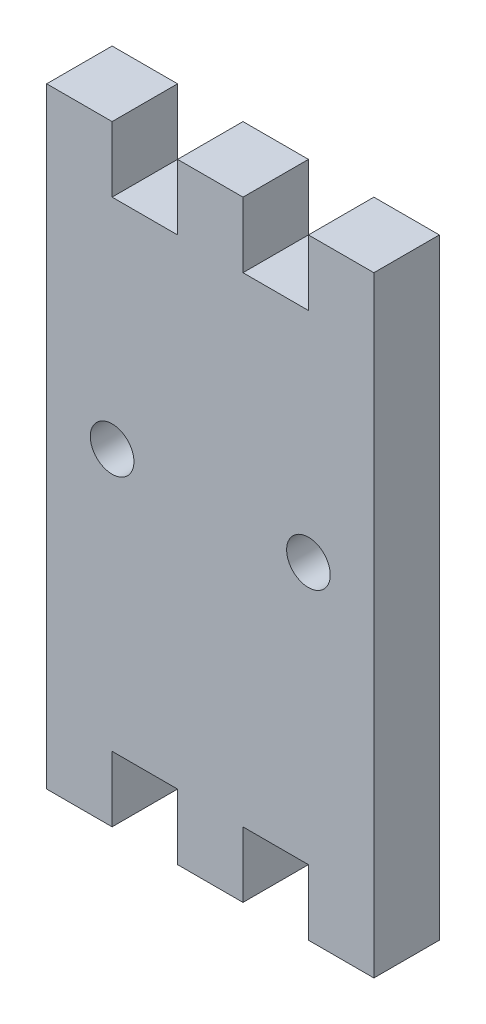
ISO-10303-21;
HEADER;
FILE_DESCRIPTION(('STEP AP214'),'2;1');
FILE_NAME('part.step','',(''),(''),'','','');
FILE_SCHEMA(('AUTOMOTIVE_DESIGN { 1 0 10303 214 1 1 1 1 }'));
ENDSEC;
DATA;
#1=APPLICATION_CONTEXT('core data for automotive mechanical design processes');
#2=APPLICATION_PROTOCOL_DEFINITION('international standard','automotive_design',2000,#1);
#3=PRODUCT_CONTEXT('',#1,'mechanical');
#4=PRODUCT('Part','Part','',(#3));
#5=PRODUCT_RELATED_PRODUCT_CATEGORY('part','',(#4));
#6=PRODUCT_DEFINITION_FORMATION('','',#4);
#7=PRODUCT_DEFINITION_CONTEXT('part definition',#1,'design');
#8=PRODUCT_DEFINITION('design','',#6,#7);
#9=PRODUCT_DEFINITION_SHAPE('','',#8);
#10=(LENGTH_UNIT() NAMED_UNIT(*) SI_UNIT(.MILLI.,.METRE.));
#11=(NAMED_UNIT(*) PLANE_ANGLE_UNIT() SI_UNIT($,.RADIAN.));
#12=(NAMED_UNIT(*) SI_UNIT($,.STERADIAN.) SOLID_ANGLE_UNIT());
#13=UNCERTAINTY_MEASURE_WITH_UNIT(LENGTH_MEASURE(1.E-05),#10,'distance_accuracy_value','');
#14=(GEOMETRIC_REPRESENTATION_CONTEXT(3) GLOBAL_UNCERTAINTY_ASSIGNED_CONTEXT((#13)) GLOBAL_UNIT_ASSIGNED_CONTEXT((#10,
#11,#12)) REPRESENTATION_CONTEXT('',''));
#15=CARTESIAN_POINT('',(0.,0.,0.));
#16=DIRECTION('',(0.,0.,1.));
#17=DIRECTION('',(1.,0.,0.));
#18=AXIS2_PLACEMENT_3D('',#15,#16,#17);
#19=CARTESIAN_POINT('',(0.,0.,3.));
#20=DIRECTION('',(0.,0.,1.));
#21=DIRECTION('',(1.,0.,0.));
#22=AXIS2_PLACEMENT_3D('',#19,#20,#21);
#23=PLANE('',#22);
#24=CARTESIAN_POINT('',(-4.5,0.999999999999999,3.));
#25=DIRECTION('',(0.,0.,1.));
#26=DIRECTION('',(1.,0.,0.));
#27=AXIS2_PLACEMENT_3D('',#24,#25,#26);
#28=CIRCLE('',#27,1.);
#29=CARTESIAN_POINT('',(-3.5,0.999999999999999,3.));
#30=VERTEX_POINT('',#29);
#31=EDGE_CURVE('E209',#30,#30,#28,.T.);
#32=ORIENTED_EDGE('',*,*,#31,.F.);
#33=EDGE_LOOP('',(#32));
#34=FACE_BOUND('',#33,.T.);
#35=DIRECTION('',(-1.,0.,0.));
#36=VECTOR('',#35,1.);
#37=CARTESIAN_POINT('',(4.5,14.,3.));
#38=LINE('',#37,#36);
#39=CARTESIAN_POINT('',(7.5,14.,3.));
#40=VERTEX_POINT('',#39);
#41=CARTESIAN_POINT('',(4.5,14.,3.));
#42=VERTEX_POINT('',#41);
#43=EDGE_CURVE('E244',#40,#42,#38,.T.);
#44=ORIENTED_EDGE('',*,*,#43,.T.);
#45=DIRECTION('',(0.,-1.,0.));
#46=VECTOR('',#45,1.);
#47=CARTESIAN_POINT('',(4.5,14.,3.));
#48=LINE('',#47,#46);
#49=CARTESIAN_POINT('',(4.5,11.,3.));
#50=VERTEX_POINT('',#49);
#51=EDGE_CURVE('E132',#42,#50,#48,.T.);
#52=ORIENTED_EDGE('',*,*,#51,.T.);
#53=DIRECTION('',(-1.,0.,0.));
#54=VECTOR('',#53,1.);
#55=CARTESIAN_POINT('',(4.5,11.,3.));
#56=LINE('',#55,#54);
#57=CARTESIAN_POINT('',(1.5,11.,3.));
#58=VERTEX_POINT('',#57);
#59=EDGE_CURVE('E295',#50,#58,#56,.T.);
#60=ORIENTED_EDGE('',*,*,#59,.T.);
#61=DIRECTION('',(0.,1.,0.));
#62=VECTOR('',#61,1.);
#63=CARTESIAN_POINT('',(1.5,14.,3.));
#64=LINE('',#63,#62);
#65=CARTESIAN_POINT('',(1.5,14.,3.));
#66=VERTEX_POINT('',#65);
#67=EDGE_CURVE('E314',#58,#66,#64,.T.);
#68=ORIENTED_EDGE('',*,*,#67,.T.);
#69=DIRECTION('',(-1.,0.,0.));
#70=VECTOR('',#69,1.);
#71=CARTESIAN_POINT('',(-1.5,14.,3.));
#72=LINE('',#71,#70);
#73=CARTESIAN_POINT('',(-1.5,14.,3.));
#74=VERTEX_POINT('',#73);
#75=EDGE_CURVE('E311',#66,#74,#72,.T.);
#76=ORIENTED_EDGE('',*,*,#75,.T.);
#77=DIRECTION('',(0.,-1.,0.));
#78=VECTOR('',#77,1.);
#79=CARTESIAN_POINT('',(-1.5,14.,3.));
#80=LINE('',#79,#78);
#81=CARTESIAN_POINT('',(-1.5,11.,3.));
#82=VERTEX_POINT('',#81);
#83=EDGE_CURVE('E313',#74,#82,#80,.T.);
#84=ORIENTED_EDGE('',*,*,#83,.T.);
#85=DIRECTION('',(-1.,0.,0.));
#86=VECTOR('',#85,1.);
#87=CARTESIAN_POINT('',(-4.5,11.,3.));
#88=LINE('',#87,#86);
#89=CARTESIAN_POINT('',(-4.5,11.,3.));
#90=VERTEX_POINT('',#89);
#91=EDGE_CURVE('E316',#82,#90,#88,.T.);
#92=ORIENTED_EDGE('',*,*,#91,.T.);
#93=DIRECTION('',(0.,1.,0.));
#94=VECTOR('',#93,1.);
#95=CARTESIAN_POINT('',(-4.5,14.,3.));
#96=LINE('',#95,#94);
#97=CARTESIAN_POINT('',(-4.5,14.,3.));
#98=VERTEX_POINT('',#97);
#99=EDGE_CURVE('E322',#90,#98,#96,.T.);
#100=ORIENTED_EDGE('',*,*,#99,.T.);
#101=DIRECTION('',(-1.,0.,0.));
#102=VECTOR('',#101,1.);
#103=CARTESIAN_POINT('',(-7.5,14.,3.));
#104=LINE('',#103,#102);
#105=CARTESIAN_POINT('',(-7.5,14.,3.));
#106=VERTEX_POINT('',#105);
#107=EDGE_CURVE('E324',#98,#106,#104,.T.);
#108=ORIENTED_EDGE('',*,*,#107,.T.);
#109=DIRECTION('',(0.,-1.,0.));
#110=VECTOR('',#109,1.);
#111=CARTESIAN_POINT('',(-7.5,-14.,3.));
#112=LINE('',#111,#110);
#113=CARTESIAN_POINT('',(-7.5,-14.,3.));
#114=VERTEX_POINT('',#113);
#115=EDGE_CURVE('E326',#106,#114,#112,.T.);
#116=ORIENTED_EDGE('',*,*,#115,.T.);
#117=DIRECTION('',(1.,0.,0.));
#118=VECTOR('',#117,1.);
#119=CARTESIAN_POINT('',(-7.5,-14.,3.));
#120=LINE('',#119,#118);
#121=CARTESIAN_POINT('',(-4.5,-14.,3.));
#122=VERTEX_POINT('',#121);
#123=EDGE_CURVE('E328',#114,#122,#120,.T.);
#124=ORIENTED_EDGE('',*,*,#123,.T.);
#125=DIRECTION('',(0.,1.,0.));
#126=VECTOR('',#125,1.);
#127=CARTESIAN_POINT('',(-4.5,-11.,3.));
#128=LINE('',#127,#126);
#129=CARTESIAN_POINT('',(-4.5,-11.,3.));
#130=VERTEX_POINT('',#129);
#131=EDGE_CURVE('E330',#122,#130,#128,.T.);
#132=ORIENTED_EDGE('',*,*,#131,.T.);
#133=DIRECTION('',(1.,0.,0.));
#134=VECTOR('',#133,1.);
#135=CARTESIAN_POINT('',(-4.5,-11.,3.));
#136=LINE('',#135,#134);
#137=CARTESIAN_POINT('',(-1.5,-11.,3.));
#138=VERTEX_POINT('',#137);
#139=EDGE_CURVE('E332',#130,#138,#136,.T.);
#140=ORIENTED_EDGE('',*,*,#139,.T.);
#141=DIRECTION('',(0.,-1.,0.));
#142=VECTOR('',#141,1.);
#143=CARTESIAN_POINT('',(-1.5,-11.,3.));
#144=LINE('',#143,#142);
#145=CARTESIAN_POINT('',(-1.5,-14.,3.));
#146=VERTEX_POINT('',#145);
#147=EDGE_CURVE('E334',#138,#146,#144,.T.);
#148=ORIENTED_EDGE('',*,*,#147,.T.);
#149=DIRECTION('',(1.,0.,0.));
#150=VECTOR('',#149,1.);
#151=CARTESIAN_POINT('',(-1.5,-14.,3.));
#152=LINE('',#151,#150);
#153=CARTESIAN_POINT('',(1.5,-14.,3.));
#154=VERTEX_POINT('',#153);
#155=EDGE_CURVE('E336',#146,#154,#152,.T.);
#156=ORIENTED_EDGE('',*,*,#155,.T.);
#157=DIRECTION('',(0.,1.,0.));
#158=VECTOR('',#157,1.);
#159=CARTESIAN_POINT('',(1.5,-11.,3.));
#160=LINE('',#159,#158);
#161=CARTESIAN_POINT('',(1.5,-11.,3.));
#162=VERTEX_POINT('',#161);
#163=EDGE_CURVE('E338',#154,#162,#160,.T.);
#164=ORIENTED_EDGE('',*,*,#163,.T.);
#165=DIRECTION('',(1.,0.,0.));
#166=VECTOR('',#165,1.);
#167=CARTESIAN_POINT('',(1.5,-11.,3.));
#168=LINE('',#167,#166);
#169=CARTESIAN_POINT('',(4.5,-11.,3.));
#170=VERTEX_POINT('',#169);
#171=EDGE_CURVE('E187',#162,#170,#168,.T.);
#172=ORIENTED_EDGE('',*,*,#171,.T.);
#173=DIRECTION('',(0.,-1.,0.));
#174=VECTOR('',#173,1.);
#175=CARTESIAN_POINT('',(4.5,-11.,3.));
#176=LINE('',#175,#174);
#177=CARTESIAN_POINT('',(4.5,-14.,3.));
#178=VERTEX_POINT('',#177);
#179=EDGE_CURVE('E181',#170,#178,#176,.T.);
#180=ORIENTED_EDGE('',*,*,#179,.T.);
#181=DIRECTION('',(1.,0.,0.));
#182=VECTOR('',#181,1.);
#183=CARTESIAN_POINT('',(4.5,-14.,3.));
#184=LINE('',#183,#182);
#185=CARTESIAN_POINT('',(7.5,-14.,3.));
#186=VERTEX_POINT('',#185);
#187=EDGE_CURVE('E185',#178,#186,#184,.T.);
#188=ORIENTED_EDGE('',*,*,#187,.T.);
#189=DIRECTION('',(0.,1.,0.));
#190=VECTOR('',#189,1.);
#191=CARTESIAN_POINT('',(7.5,-14.,3.));
#192=LINE('',#191,#190);
#193=EDGE_CURVE('E53',#186,#40,#192,.T.);
#194=ORIENTED_EDGE('',*,*,#193,.T.);
#195=EDGE_LOOP('',(#44,#52,#60,#68,#76,#84,#92,#100,#108,#116,#124,#132,#140,#148,#156,#164,
#172,#180,#188,#194));
#196=FACE_BOUND('',#195,.T.);
#197=CARTESIAN_POINT('',(4.5,1.,3.));
#198=DIRECTION('',(0.,0.,1.));
#199=DIRECTION('',(-1.,0.,0.));
#200=AXIS2_PLACEMENT_3D('',#197,#198,#199);
#201=CIRCLE('',#200,1.);
#202=CARTESIAN_POINT('',(3.5,1.,3.));
#203=VERTEX_POINT('',#202);
#204=EDGE_CURVE('E380',#203,#203,#201,.T.);
#205=ORIENTED_EDGE('',*,*,#204,.F.);
#206=EDGE_LOOP('',(#205));
#207=FACE_BOUND('',#206,.T.);
#208=ADVANCED_FACE('F36',(#34,#196,#207),#23,.T.);
#209=CARTESIAN_POINT('',(0.,0.,0.));
#210=DIRECTION('',(0.,0.,1.));
#211=DIRECTION('',(1.,0.,0.));
#212=AXIS2_PLACEMENT_3D('',#209,#210,#211);
#213=PLANE('',#212);
#214=DIRECTION('',(-1.,0.,0.));
#215=VECTOR('',#214,1.);
#216=CARTESIAN_POINT('',(4.5,14.,0.));
#217=LINE('',#216,#215);
#218=CARTESIAN_POINT('',(7.5,14.,0.));
#219=VERTEX_POINT('',#218);
#220=CARTESIAN_POINT('',(4.5,14.,0.));
#221=VERTEX_POINT('',#220);
#222=EDGE_CURVE('E205',#219,#221,#217,.T.);
#223=ORIENTED_EDGE('',*,*,#222,.F.);
#224=DIRECTION('',(0.,1.,0.));
#225=VECTOR('',#224,1.);
#226=CARTESIAN_POINT('',(7.5,-14.,0.));
#227=LINE('',#226,#225);
#228=CARTESIAN_POINT('',(7.5,-14.,0.));
#229=VERTEX_POINT('',#228);
#230=EDGE_CURVE('E124',#229,#219,#227,.T.);
#231=ORIENTED_EDGE('',*,*,#230,.F.);
#232=DIRECTION('',(1.,0.,0.));
#233=VECTOR('',#232,1.);
#234=CARTESIAN_POINT('',(4.5,-14.,0.));
#235=LINE('',#234,#233);
#236=CARTESIAN_POINT('',(4.5,-14.,0.));
#237=VERTEX_POINT('',#236);
#238=EDGE_CURVE('E118',#237,#229,#235,.T.);
#239=ORIENTED_EDGE('',*,*,#238,.F.);
#240=DIRECTION('',(0.,-1.,0.));
#241=VECTOR('',#240,1.);
#242=CARTESIAN_POINT('',(4.5,-11.,0.));
#243=LINE('',#242,#241);
#244=CARTESIAN_POINT('',(4.5,-11.,0.));
#245=VERTEX_POINT('',#244);
#246=EDGE_CURVE('E195',#245,#237,#243,.T.);
#247=ORIENTED_EDGE('',*,*,#246,.F.);
#248=DIRECTION('',(1.,0.,0.));
#249=VECTOR('',#248,1.);
#250=CARTESIAN_POINT('',(1.5,-11.,0.));
#251=LINE('',#250,#249);
#252=CARTESIAN_POINT('',(1.5,-11.,0.));
#253=VERTEX_POINT('',#252);
#254=EDGE_CURVE('E239',#253,#245,#251,.T.);
#255=ORIENTED_EDGE('',*,*,#254,.F.);
#256=DIRECTION('',(0.,1.,0.));
#257=VECTOR('',#256,1.);
#258=CARTESIAN_POINT('',(1.5,-11.,0.));
#259=LINE('',#258,#257);
#260=CARTESIAN_POINT('',(1.5,-14.,0.));
#261=VERTEX_POINT('',#260);
#262=EDGE_CURVE('E237',#261,#253,#259,.T.);
#263=ORIENTED_EDGE('',*,*,#262,.F.);
#264=DIRECTION('',(1.,0.,0.));
#265=VECTOR('',#264,1.);
#266=CARTESIAN_POINT('',(-1.5,-14.,0.));
#267=LINE('',#266,#265);
#268=CARTESIAN_POINT('',(-1.5,-14.,0.));
#269=VERTEX_POINT('',#268);
#270=EDGE_CURVE('E235',#269,#261,#267,.T.);
#271=ORIENTED_EDGE('',*,*,#270,.F.);
#272=DIRECTION('',(0.,-1.,0.));
#273=VECTOR('',#272,1.);
#274=CARTESIAN_POINT('',(-1.5,-11.,0.));
#275=LINE('',#274,#273);
#276=CARTESIAN_POINT('',(-1.5,-11.,0.));
#277=VERTEX_POINT('',#276);
#278=EDGE_CURVE('E233',#277,#269,#275,.T.);
#279=ORIENTED_EDGE('',*,*,#278,.F.);
#280=DIRECTION('',(1.,0.,0.));
#281=VECTOR('',#280,1.);
#282=CARTESIAN_POINT('',(-4.5,-11.,0.));
#283=LINE('',#282,#281);
#284=CARTESIAN_POINT('',(-4.5,-11.,0.));
#285=VERTEX_POINT('',#284);
#286=EDGE_CURVE('E231',#285,#277,#283,.T.);
#287=ORIENTED_EDGE('',*,*,#286,.F.);
#288=DIRECTION('',(0.,1.,0.));
#289=VECTOR('',#288,1.);
#290=CARTESIAN_POINT('',(-4.5,-11.,0.));
#291=LINE('',#290,#289);
#292=CARTESIAN_POINT('',(-4.5,-14.,0.));
#293=VERTEX_POINT('',#292);
#294=EDGE_CURVE('E229',#293,#285,#291,.T.);
#295=ORIENTED_EDGE('',*,*,#294,.F.);
#296=DIRECTION('',(1.,0.,0.));
#297=VECTOR('',#296,1.);
#298=CARTESIAN_POINT('',(-7.5,-14.,0.));
#299=LINE('',#298,#297);
#300=CARTESIAN_POINT('',(-7.5,-14.,0.));
#301=VERTEX_POINT('',#300);
#302=EDGE_CURVE('E227',#301,#293,#299,.T.);
#303=ORIENTED_EDGE('',*,*,#302,.F.);
#304=DIRECTION('',(0.,-1.,0.));
#305=VECTOR('',#304,1.);
#306=CARTESIAN_POINT('',(-7.5,-14.,0.));
#307=LINE('',#306,#305);
#308=CARTESIAN_POINT('',(-7.5,14.,0.));
#309=VERTEX_POINT('',#308);
#310=EDGE_CURVE('E225',#309,#301,#307,.T.);
#311=ORIENTED_EDGE('',*,*,#310,.F.);
#312=DIRECTION('',(-1.,0.,0.));
#313=VECTOR('',#312,1.);
#314=CARTESIAN_POINT('',(-7.5,14.,0.));
#315=LINE('',#314,#313);
#316=CARTESIAN_POINT('',(-4.5,14.,0.));
#317=VERTEX_POINT('',#316);
#318=EDGE_CURVE('E223',#317,#309,#315,.T.);
#319=ORIENTED_EDGE('',*,*,#318,.F.);
#320=DIRECTION('',(0.,1.,0.));
#321=VECTOR('',#320,1.);
#322=CARTESIAN_POINT('',(-4.5,14.,0.));
#323=LINE('',#322,#321);
#324=CARTESIAN_POINT('',(-4.5,11.,0.));
#325=VERTEX_POINT('',#324);
#326=EDGE_CURVE('E221',#325,#317,#323,.T.);
#327=ORIENTED_EDGE('',*,*,#326,.F.);
#328=DIRECTION('',(-1.,0.,0.));
#329=VECTOR('',#328,1.);
#330=CARTESIAN_POINT('',(-4.5,11.,0.));
#331=LINE('',#330,#329);
#332=CARTESIAN_POINT('',(-1.5,11.,0.));
#333=VERTEX_POINT('',#332);
#334=EDGE_CURVE('E219',#333,#325,#331,.T.);
#335=ORIENTED_EDGE('',*,*,#334,.F.);
#336=DIRECTION('',(0.,-1.,0.));
#337=VECTOR('',#336,1.);
#338=CARTESIAN_POINT('',(-1.5,14.,0.));
#339=LINE('',#338,#337);
#340=CARTESIAN_POINT('',(-1.5,14.,0.));
#341=VERTEX_POINT('',#340);
#342=EDGE_CURVE('E217',#341,#333,#339,.T.);
#343=ORIENTED_EDGE('',*,*,#342,.F.);
#344=DIRECTION('',(-1.,0.,0.));
#345=VECTOR('',#344,1.);
#346=CARTESIAN_POINT('',(-1.5,14.,0.));
#347=LINE('',#346,#345);
#348=CARTESIAN_POINT('',(1.5,14.,0.));
#349=VERTEX_POINT('',#348);
#350=EDGE_CURVE('E215',#349,#341,#347,.T.);
#351=ORIENTED_EDGE('',*,*,#350,.F.);
#352=DIRECTION('',(0.,1.,0.));
#353=VECTOR('',#352,1.);
#354=CARTESIAN_POINT('',(1.5,14.,0.));
#355=LINE('',#354,#353);
#356=CARTESIAN_POINT('',(1.5,11.,0.));
#357=VERTEX_POINT('',#356);
#358=EDGE_CURVE('E213',#357,#349,#355,.T.);
#359=ORIENTED_EDGE('',*,*,#358,.F.);
#360=DIRECTION('',(-1.,0.,0.));
#361=VECTOR('',#360,1.);
#362=CARTESIAN_POINT('',(4.5,11.,0.));
#363=LINE('',#362,#361);
#364=CARTESIAN_POINT('',(4.5,11.,0.));
#365=VERTEX_POINT('',#364);
#366=EDGE_CURVE('E211',#365,#357,#363,.T.);
#367=ORIENTED_EDGE('',*,*,#366,.F.);
#368=DIRECTION('',(0.,-1.,0.));
#369=VECTOR('',#368,1.);
#370=CARTESIAN_POINT('',(4.5,14.,0.));
#371=LINE('',#370,#369);
#372=EDGE_CURVE('E208',#221,#365,#371,.T.);
#373=ORIENTED_EDGE('',*,*,#372,.F.);
#374=EDGE_LOOP('',(#223,#231,#239,#247,#255,#263,#271,#279,#287,#295,#303,#311,#319,#327,#335,
#343,#351,#359,#367,#373));
#375=FACE_BOUND('',#374,.T.);
#376=CARTESIAN_POINT('',(-4.5,0.999999999999999,0.));
#377=DIRECTION('',(0.,0.,1.));
#378=DIRECTION('',(1.,0.,0.));
#379=AXIS2_PLACEMENT_3D('',#376,#377,#378);
#380=CIRCLE('',#379,1.);
#381=CARTESIAN_POINT('',(-3.5,0.999999999999999,0.));
#382=VERTEX_POINT('',#381);
#383=EDGE_CURVE('E386',#382,#382,#380,.T.);
#384=ORIENTED_EDGE('',*,*,#383,.T.);
#385=EDGE_LOOP('',(#384));
#386=FACE_BOUND('',#385,.T.);
#387=CARTESIAN_POINT('',(4.5,1.,0.));
#388=DIRECTION('',(0.,0.,1.));
#389=DIRECTION('',(-1.,0.,0.));
#390=AXIS2_PLACEMENT_3D('',#387,#388,#389);
#391=CIRCLE('',#390,1.);
#392=CARTESIAN_POINT('',(3.5,1.,0.));
#393=VERTEX_POINT('',#392);
#394=EDGE_CURVE('E383',#393,#393,#391,.T.);
#395=ORIENTED_EDGE('',*,*,#394,.T.);
#396=EDGE_LOOP('',(#395));
#397=FACE_BOUND('',#396,.T.);
#398=ADVANCED_FACE('F299',(#375,#386,#397),#213,.F.);
#399=CARTESIAN_POINT('',(4.5,14.,3.));
#400=DIRECTION('',(0.,-1.,0.));
#401=DIRECTION('',(1.,0.,0.));
#402=AXIS2_PLACEMENT_3D('',#399,#400,#401);
#403=PLANE('',#402);
#404=ORIENTED_EDGE('',*,*,#222,.T.);
#405=DIRECTION('',(0.,0.,-1.));
#406=VECTOR('',#405,1.);
#407=CARTESIAN_POINT('',(4.5,14.,3.));
#408=LINE('',#407,#406);
#409=EDGE_CURVE('E11',#42,#221,#408,.T.);
#410=ORIENTED_EDGE('',*,*,#409,.F.);
#411=ORIENTED_EDGE('',*,*,#43,.F.);
#412=DIRECTION('',(0.,0.,-1.));
#413=VECTOR('',#412,1.);
#414=CARTESIAN_POINT('',(7.5,14.,3.));
#415=LINE('',#414,#413);
#416=EDGE_CURVE('E201',#40,#219,#415,.T.);
#417=ORIENTED_EDGE('',*,*,#416,.T.);
#418=EDGE_LOOP('',(#404,#410,#411,#417));
#419=FACE_BOUND('',#418,.T.);
#420=ADVANCED_FACE('F38',(#419),#403,.F.);
#421=CARTESIAN_POINT('',(4.5,14.,3.));
#422=DIRECTION('',(1.,0.,0.));
#423=DIRECTION('',(0.,0.,-1.));
#424=AXIS2_PLACEMENT_3D('',#421,#422,#423);
#425=PLANE('',#424);
#426=ORIENTED_EDGE('',*,*,#372,.T.);
#427=DIRECTION('',(0.,0.,-1.));
#428=VECTOR('',#427,1.);
#429=CARTESIAN_POINT('',(4.5,11.,3.));
#430=LINE('',#429,#428);
#431=EDGE_CURVE('E45',#50,#365,#430,.T.);
#432=ORIENTED_EDGE('',*,*,#431,.F.);
#433=ORIENTED_EDGE('',*,*,#51,.F.);
#434=ORIENTED_EDGE('',*,*,#409,.T.);
#435=EDGE_LOOP('',(#426,#432,#433,#434));
#436=FACE_BOUND('',#435,.T.);
#437=ADVANCED_FACE('F559',(#436),#425,.F.);
#438=CARTESIAN_POINT('',(4.5,11.,3.));
#439=DIRECTION('',(0.,-1.,0.));
#440=DIRECTION('',(1.,0.,0.));
#441=AXIS2_PLACEMENT_3D('',#438,#439,#440);
#442=PLANE('',#441);
#443=ORIENTED_EDGE('',*,*,#366,.T.);
#444=DIRECTION('',(0.,0.,-1.));
#445=VECTOR('',#444,1.);
#446=CARTESIAN_POINT('',(1.5,11.,3.));
#447=LINE('',#446,#445);
#448=EDGE_CURVE('E287',#58,#357,#447,.T.);
#449=ORIENTED_EDGE('',*,*,#448,.F.);
#450=ORIENTED_EDGE('',*,*,#59,.F.);
#451=ORIENTED_EDGE('',*,*,#431,.T.);
#452=EDGE_LOOP('',(#443,#449,#450,#451));
#453=FACE_BOUND('',#452,.T.);
#454=ADVANCED_FACE('F293',(#453),#442,.F.);
#455=CARTESIAN_POINT('',(1.5,14.,3.));
#456=DIRECTION('',(-1.,0.,0.));
#457=DIRECTION('',(0.,-1.,0.));
#458=AXIS2_PLACEMENT_3D('',#455,#456,#457);
#459=PLANE('',#458);
#460=ORIENTED_EDGE('',*,*,#358,.T.);
#461=DIRECTION('',(0.,0.,-1.));
#462=VECTOR('',#461,1.);
#463=CARTESIAN_POINT('',(1.5,14.,3.));
#464=LINE('',#463,#462);
#465=EDGE_CURVE('E284',#66,#349,#464,.T.);
#466=ORIENTED_EDGE('',*,*,#465,.F.);
#467=ORIENTED_EDGE('',*,*,#67,.F.);
#468=ORIENTED_EDGE('',*,*,#448,.T.);
#469=EDGE_LOOP('',(#460,#466,#467,#468));
#470=FACE_BOUND('',#469,.T.);
#471=ADVANCED_FACE('F305',(#470),#459,.F.);
#472=CARTESIAN_POINT('',(-1.5,14.,3.));
#473=DIRECTION('',(0.,-1.,0.));
#474=DIRECTION('',(0.,0.,-1.));
#475=AXIS2_PLACEMENT_3D('',#472,#473,#474);
#476=PLANE('',#475);
#477=ORIENTED_EDGE('',*,*,#350,.T.);
#478=DIRECTION('',(0.,0.,-1.));
#479=VECTOR('',#478,1.);
#480=CARTESIAN_POINT('',(-1.5,14.,3.));
#481=LINE('',#480,#479);
#482=EDGE_CURVE('E281',#74,#341,#481,.T.);
#483=ORIENTED_EDGE('',*,*,#482,.F.);
#484=ORIENTED_EDGE('',*,*,#75,.F.);
#485=ORIENTED_EDGE('',*,*,#465,.T.);
#486=EDGE_LOOP('',(#477,#483,#484,#485));
#487=FACE_BOUND('',#486,.T.);
#488=ADVANCED_FACE('F309',(#487),#476,.F.);
#489=CARTESIAN_POINT('',(-1.5,14.,3.));
#490=DIRECTION('',(1.,0.,0.));
#491=DIRECTION('',(0.,1.,0.));
#492=AXIS2_PLACEMENT_3D('',#489,#490,#491);
#493=PLANE('',#492);
#494=ORIENTED_EDGE('',*,*,#342,.T.);
#495=DIRECTION('',(0.,0.,-1.));
#496=VECTOR('',#495,1.);
#497=CARTESIAN_POINT('',(-1.5,11.,3.));
#498=LINE('',#497,#496);
#499=EDGE_CURVE('E278',#82,#333,#498,.T.);
#500=ORIENTED_EDGE('',*,*,#499,.F.);
#501=ORIENTED_EDGE('',*,*,#83,.F.);
#502=ORIENTED_EDGE('',*,*,#482,.T.);
#503=EDGE_LOOP('',(#494,#500,#501,#502));
#504=FACE_BOUND('',#503,.T.);
#505=ADVANCED_FACE('F524',(#504),#493,.F.);
#506=CARTESIAN_POINT('',(-4.5,11.,3.));
#507=DIRECTION('',(0.,-1.,0.));
#508=DIRECTION('',(0.,0.,-1.));
#509=AXIS2_PLACEMENT_3D('',#506,#507,#508);
#510=PLANE('',#509);
#511=ORIENTED_EDGE('',*,*,#334,.T.);
#512=DIRECTION('',(0.,0.,-1.));
#513=VECTOR('',#512,1.);
#514=CARTESIAN_POINT('',(-4.5,11.,3.));
#515=LINE('',#514,#513);
#516=EDGE_CURVE('E275',#90,#325,#515,.T.);
#517=ORIENTED_EDGE('',*,*,#516,.F.);
#518=ORIENTED_EDGE('',*,*,#91,.F.);
#519=ORIENTED_EDGE('',*,*,#499,.T.);
#520=EDGE_LOOP('',(#511,#517,#518,#519));
#521=FACE_BOUND('',#520,.T.);
#522=ADVANCED_FACE('F514',(#521),#510,.F.);
#523=CARTESIAN_POINT('',(-4.5,14.,3.));
#524=DIRECTION('',(-1.,0.,0.));
#525=DIRECTION('',(0.,0.,1.));
#526=AXIS2_PLACEMENT_3D('',#523,#524,#525);
#527=PLANE('',#526);
#528=ORIENTED_EDGE('',*,*,#326,.T.);
#529=DIRECTION('',(0.,0.,-1.));
#530=VECTOR('',#529,1.);
#531=CARTESIAN_POINT('',(-4.5,14.,3.));
#532=LINE('',#531,#530);
#533=EDGE_CURVE('E272',#98,#317,#532,.T.);
#534=ORIENTED_EDGE('',*,*,#533,.F.);
#535=ORIENTED_EDGE('',*,*,#99,.F.);
#536=ORIENTED_EDGE('',*,*,#516,.T.);
#537=EDGE_LOOP('',(#528,#534,#535,#536));
#538=FACE_BOUND('',#537,.T.);
#539=ADVANCED_FACE('F504',(#538),#527,.F.);
#540=CARTESIAN_POINT('',(-7.5,14.,3.));
#541=DIRECTION('',(0.,-1.,0.));
#542=DIRECTION('',(0.,0.,-1.));
#543=AXIS2_PLACEMENT_3D('',#540,#541,#542);
#544=PLANE('',#543);
#545=ORIENTED_EDGE('',*,*,#318,.T.);
#546=DIRECTION('',(0.,0.,-1.));
#547=VECTOR('',#546,1.);
#548=CARTESIAN_POINT('',(-7.5,14.,3.));
#549=LINE('',#548,#547);
#550=EDGE_CURVE('E269',#106,#309,#549,.T.);
#551=ORIENTED_EDGE('',*,*,#550,.F.);
#552=ORIENTED_EDGE('',*,*,#107,.F.);
#553=ORIENTED_EDGE('',*,*,#533,.T.);
#554=EDGE_LOOP('',(#545,#551,#552,#553));
#555=FACE_BOUND('',#554,.T.);
#556=ADVANCED_FACE('F494',(#555),#544,.F.);
#557=CARTESIAN_POINT('',(-7.5,-14.,3.));
#558=DIRECTION('',(1.,0.,0.));
#559=DIRECTION('',(0.,1.,0.));
#560=AXIS2_PLACEMENT_3D('',#557,#558,#559);
#561=PLANE('',#560);
#562=ORIENTED_EDGE('',*,*,#310,.T.);
#563=DIRECTION('',(0.,0.,-1.));
#564=VECTOR('',#563,1.);
#565=CARTESIAN_POINT('',(-7.5,-14.,3.));
#566=LINE('',#565,#564);
#567=EDGE_CURVE('E266',#114,#301,#566,.T.);
#568=ORIENTED_EDGE('',*,*,#567,.F.);
#569=ORIENTED_EDGE('',*,*,#115,.F.);
#570=ORIENTED_EDGE('',*,*,#550,.T.);
#571=EDGE_LOOP('',(#562,#568,#569,#570));
#572=FACE_BOUND('',#571,.T.);
#573=ADVANCED_FACE('F484',(#572),#561,.F.);
#574=CARTESIAN_POINT('',(-7.5,-14.,3.));
#575=DIRECTION('',(0.,1.,0.));
#576=DIRECTION('',(-1.,0.,0.));
#577=AXIS2_PLACEMENT_3D('',#574,#575,#576);
#578=PLANE('',#577);
#579=ORIENTED_EDGE('',*,*,#302,.T.);
#580=DIRECTION('',(0.,0.,-1.));
#581=VECTOR('',#580,1.);
#582=CARTESIAN_POINT('',(-4.5,-14.,3.));
#583=LINE('',#582,#581);
#584=EDGE_CURVE('E263',#122,#293,#583,.T.);
#585=ORIENTED_EDGE('',*,*,#584,.F.);
#586=ORIENTED_EDGE('',*,*,#123,.F.);
#587=ORIENTED_EDGE('',*,*,#567,.T.);
#588=EDGE_LOOP('',(#579,#585,#586,#587));
#589=FACE_BOUND('',#588,.T.);
#590=ADVANCED_FACE('F474',(#589),#578,.F.);
#591=CARTESIAN_POINT('',(-4.5,-11.,3.));
#592=DIRECTION('',(-1.,0.,0.));
#593=DIRECTION('',(0.,0.,1.));
#594=AXIS2_PLACEMENT_3D('',#591,#592,#593);
#595=PLANE('',#594);
#596=ORIENTED_EDGE('',*,*,#294,.T.);
#597=DIRECTION('',(0.,0.,-1.));
#598=VECTOR('',#597,1.);
#599=CARTESIAN_POINT('',(-4.5,-11.,3.));
#600=LINE('',#599,#598);
#601=EDGE_CURVE('E260',#130,#285,#600,.T.);
#602=ORIENTED_EDGE('',*,*,#601,.F.);
#603=ORIENTED_EDGE('',*,*,#131,.F.);
#604=ORIENTED_EDGE('',*,*,#584,.T.);
#605=EDGE_LOOP('',(#596,#602,#603,#604));
#606=FACE_BOUND('',#605,.T.);
#607=ADVANCED_FACE('F464',(#606),#595,.F.);
#608=CARTESIAN_POINT('',(-4.5,-11.,3.));
#609=DIRECTION('',(0.,1.,0.));
#610=DIRECTION('',(0.,0.,1.));
#611=AXIS2_PLACEMENT_3D('',#608,#609,#610);
#612=PLANE('',#611);
#613=ORIENTED_EDGE('',*,*,#286,.T.);
#614=DIRECTION('',(0.,0.,-1.));
#615=VECTOR('',#614,1.);
#616=CARTESIAN_POINT('',(-1.5,-11.,3.));
#617=LINE('',#616,#615);
#618=EDGE_CURVE('E257',#138,#277,#617,.T.);
#619=ORIENTED_EDGE('',*,*,#618,.F.);
#620=ORIENTED_EDGE('',*,*,#139,.F.);
#621=ORIENTED_EDGE('',*,*,#601,.T.);
#622=EDGE_LOOP('',(#613,#619,#620,#621));
#623=FACE_BOUND('',#622,.T.);
#624=ADVANCED_FACE('F454',(#623),#612,.F.);
#625=CARTESIAN_POINT('',(-1.5,-11.,3.));
#626=DIRECTION('',(1.,0.,0.));
#627=DIRECTION('',(0.,1.,0.));
#628=AXIS2_PLACEMENT_3D('',#625,#626,#627);
#629=PLANE('',#628);
#630=ORIENTED_EDGE('',*,*,#278,.T.);
#631=DIRECTION('',(0.,0.,-1.));
#632=VECTOR('',#631,1.);
#633=CARTESIAN_POINT('',(-1.5,-14.,3.));
#634=LINE('',#633,#632);
#635=EDGE_CURVE('E254',#146,#269,#634,.T.);
#636=ORIENTED_EDGE('',*,*,#635,.F.);
#637=ORIENTED_EDGE('',*,*,#147,.F.);
#638=ORIENTED_EDGE('',*,*,#618,.T.);
#639=EDGE_LOOP('',(#630,#636,#637,#638));
#640=FACE_BOUND('',#639,.T.);
#641=ADVANCED_FACE('F444',(#640),#629,.F.);
#642=CARTESIAN_POINT('',(-1.5,-14.,3.));
#643=DIRECTION('',(0.,1.,0.));
#644=DIRECTION('',(-1.,0.,0.));
#645=AXIS2_PLACEMENT_3D('',#642,#643,#644);
#646=PLANE('',#645);
#647=ORIENTED_EDGE('',*,*,#270,.T.);
#648=DIRECTION('',(0.,0.,-1.));
#649=VECTOR('',#648,1.);
#650=CARTESIAN_POINT('',(1.5,-14.,3.));
#651=LINE('',#650,#649);
#652=EDGE_CURVE('E251',#154,#261,#651,.T.);
#653=ORIENTED_EDGE('',*,*,#652,.F.);
#654=ORIENTED_EDGE('',*,*,#155,.F.);
#655=ORIENTED_EDGE('',*,*,#635,.T.);
#656=EDGE_LOOP('',(#647,#653,#654,#655));
#657=FACE_BOUND('',#656,.T.);
#658=ADVANCED_FACE('F435',(#657),#646,.F.);
#659=CARTESIAN_POINT('',(1.5,-11.,3.));
#660=DIRECTION('',(-1.,0.,0.));
#661=DIRECTION('',(0.,-1.,0.));
#662=AXIS2_PLACEMENT_3D('',#659,#660,#661);
#663=PLANE('',#662);
#664=ORIENTED_EDGE('',*,*,#262,.T.);
#665=DIRECTION('',(0.,0.,-1.));
#666=VECTOR('',#665,1.);
#667=CARTESIAN_POINT('',(1.5,-11.,3.));
#668=LINE('',#667,#666);
#669=EDGE_CURVE('E248',#162,#253,#668,.T.);
#670=ORIENTED_EDGE('',*,*,#669,.F.);
#671=ORIENTED_EDGE('',*,*,#163,.F.);
#672=ORIENTED_EDGE('',*,*,#652,.T.);
#673=EDGE_LOOP('',(#664,#670,#671,#672));
#674=FACE_BOUND('',#673,.T.);
#675=ADVANCED_FACE('F344',(#674),#663,.F.);
#676=CARTESIAN_POINT('',(1.5,-11.,3.));
#677=DIRECTION('',(0.,1.,0.));
#678=DIRECTION('',(0.,0.,1.));
#679=AXIS2_PLACEMENT_3D('',#676,#677,#678);
#680=PLANE('',#679);
#681=ORIENTED_EDGE('',*,*,#254,.T.);
#682=DIRECTION('',(0.,0.,-1.));
#683=VECTOR('',#682,1.);
#684=CARTESIAN_POINT('',(4.5,-11.,3.));
#685=LINE('',#684,#683);
#686=EDGE_CURVE('E196',#170,#245,#685,.T.);
#687=ORIENTED_EDGE('',*,*,#686,.F.);
#688=ORIENTED_EDGE('',*,*,#171,.F.);
#689=ORIENTED_EDGE('',*,*,#669,.T.);
#690=EDGE_LOOP('',(#681,#687,#688,#689));
#691=FACE_BOUND('',#690,.T.);
#692=ADVANCED_FACE('F348',(#691),#680,.F.);
#693=CARTESIAN_POINT('',(4.5,-11.,3.));
#694=DIRECTION('',(1.,0.,0.));
#695=DIRECTION('',(0.,1.,0.));
#696=AXIS2_PLACEMENT_3D('',#693,#694,#695);
#697=PLANE('',#696);
#698=ORIENTED_EDGE('',*,*,#246,.T.);
#699=DIRECTION('',(0.,0.,-1.));
#700=VECTOR('',#699,1.);
#701=CARTESIAN_POINT('',(4.5,-14.,3.));
#702=LINE('',#701,#700);
#703=EDGE_CURVE('E192',#178,#237,#702,.T.);
#704=ORIENTED_EDGE('',*,*,#703,.F.);
#705=ORIENTED_EDGE('',*,*,#179,.F.);
#706=ORIENTED_EDGE('',*,*,#686,.T.);
#707=EDGE_LOOP('',(#698,#704,#705,#706));
#708=FACE_BOUND('',#707,.T.);
#709=ADVANCED_FACE('F193',(#708),#697,.F.);
#710=CARTESIAN_POINT('',(4.5,-14.,3.));
#711=DIRECTION('',(0.,1.,0.));
#712=DIRECTION('',(-1.,0.,0.));
#713=AXIS2_PLACEMENT_3D('',#710,#711,#712);
#714=PLANE('',#713);
#715=ORIENTED_EDGE('',*,*,#238,.T.);
#716=DIRECTION('',(0.,0.,-1.));
#717=VECTOR('',#716,1.);
#718=CARTESIAN_POINT('',(7.5,-14.,3.));
#719=LINE('',#718,#717);
#720=EDGE_CURVE('E197',#186,#229,#719,.T.);
#721=ORIENTED_EDGE('',*,*,#720,.F.);
#722=ORIENTED_EDGE('',*,*,#187,.F.);
#723=ORIENTED_EDGE('',*,*,#703,.T.);
#724=EDGE_LOOP('',(#715,#721,#722,#723));
#725=FACE_BOUND('',#724,.T.);
#726=ADVANCED_FACE('F199',(#725),#714,.F.);
#727=CARTESIAN_POINT('',(7.5,-14.,3.));
#728=DIRECTION('',(-1.,0.,0.));
#729=DIRECTION('',(0.,-1.,0.));
#730=AXIS2_PLACEMENT_3D('',#727,#728,#729);
#731=PLANE('',#730);
#732=ORIENTED_EDGE('',*,*,#230,.T.);
#733=ORIENTED_EDGE('',*,*,#416,.F.);
#734=ORIENTED_EDGE('',*,*,#193,.F.);
#735=ORIENTED_EDGE('',*,*,#720,.T.);
#736=EDGE_LOOP('',(#732,#733,#734,#735));
#737=FACE_BOUND('',#736,.T.);
#738=ADVANCED_FACE('F352',(#737),#731,.F.);
#739=CARTESIAN_POINT('',(-4.5,0.999999999999999,3.));
#740=DIRECTION('',(0.,0.,-1.));
#741=DIRECTION('',(-1.,0.,0.));
#742=AXIS2_PLACEMENT_3D('',#739,#740,#741);
#743=CYLINDRICAL_SURFACE('',#742,1.);
#744=ORIENTED_EDGE('',*,*,#31,.T.);
#745=EDGE_LOOP('',(#744));
#746=FACE_BOUND('',#745,.T.);
#747=ORIENTED_EDGE('',*,*,#383,.F.);
#748=EDGE_LOOP('',(#747));
#749=FACE_BOUND('',#748,.T.);
#750=ADVANCED_FACE('F354',(#746,#749),#743,.F.);
#751=CARTESIAN_POINT('',(4.5,1.,3.));
#752=DIRECTION('',(0.,0.,-1.));
#753=DIRECTION('',(-1.,0.,0.));
#754=AXIS2_PLACEMENT_3D('',#751,#752,#753);
#755=CYLINDRICAL_SURFACE('',#754,1.);
#756=ORIENTED_EDGE('',*,*,#204,.T.);
#757=EDGE_LOOP('',(#756));
#758=FACE_BOUND('',#757,.T.);
#759=ORIENTED_EDGE('',*,*,#394,.F.);
#760=EDGE_LOOP('',(#759));
#761=FACE_BOUND('',#760,.T.);
#762=ADVANCED_FACE('F360',(#758,#761),#755,.F.);
#763=CLOSED_SHELL('',(#208,#398,#420,#437,#454,#471,#488,#505,#522,#539,#556,#573,#590,#607,
#624,#641,#658,#675,#692,#709,#726,#738,#750,#762));
#764=MANIFOLD_SOLID_BREP('B2',#763);
#765=ADVANCED_BREP_SHAPE_REPRESENTATION('',(#18,#764),#14);
#766=SHAPE_DEFINITION_REPRESENTATION(#9,#765);
ENDSEC;
END-ISO-10303-21;
